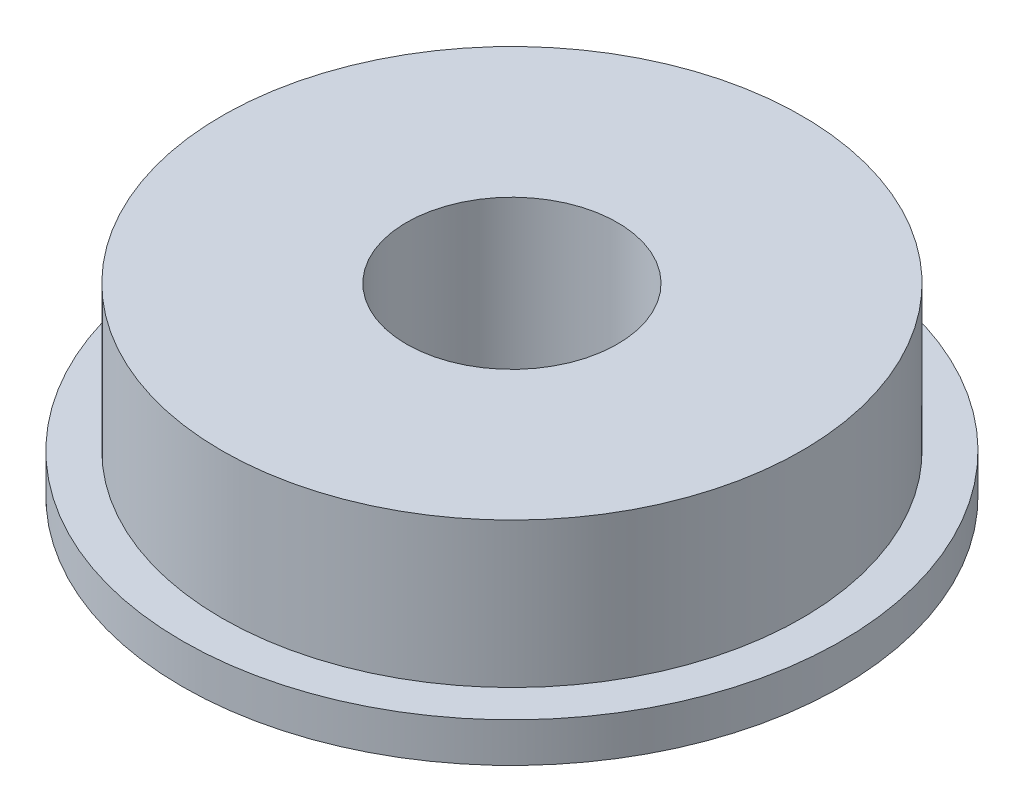
ISO-10303-21;
HEADER;
FILE_DESCRIPTION(('STEP AP214'),'2;1');
FILE_NAME('part.step','',(''),(''),'','','');
FILE_SCHEMA(('AUTOMOTIVE_DESIGN { 1 0 10303 214 1 1 1 1 }'));
ENDSEC;
DATA;
#1=APPLICATION_CONTEXT('core data for automotive mechanical design processes');
#2=APPLICATION_PROTOCOL_DEFINITION('international standard','automotive_design',2000,#1);
#3=PRODUCT_CONTEXT('',#1,'mechanical');
#4=PRODUCT('Part','Part','',(#3));
#5=PRODUCT_RELATED_PRODUCT_CATEGORY('part','',(#4));
#6=PRODUCT_DEFINITION_FORMATION('','',#4);
#7=PRODUCT_DEFINITION_CONTEXT('part definition',#1,'design');
#8=PRODUCT_DEFINITION('design','',#6,#7);
#9=PRODUCT_DEFINITION_SHAPE('','',#8);
#10=(LENGTH_UNIT() NAMED_UNIT(*) SI_UNIT(.MILLI.,.METRE.));
#11=(NAMED_UNIT(*) PLANE_ANGLE_UNIT() SI_UNIT($,.RADIAN.));
#12=(NAMED_UNIT(*) SI_UNIT($,.STERADIAN.) SOLID_ANGLE_UNIT());
#13=UNCERTAINTY_MEASURE_WITH_UNIT(LENGTH_MEASURE(1.E-05),#10,'distance_accuracy_value','');
#14=(GEOMETRIC_REPRESENTATION_CONTEXT(3) GLOBAL_UNCERTAINTY_ASSIGNED_CONTEXT((#13)) GLOBAL_UNIT_ASSIGNED_CONTEXT((#10,
#11,#12)) REPRESENTATION_CONTEXT('',''));
#15=CARTESIAN_POINT('',(0.,0.,0.));
#16=DIRECTION('',(0.,0.,1.));
#17=DIRECTION('',(1.,0.,0.));
#18=AXIS2_PLACEMENT_3D('',#15,#16,#17);
#19=CARTESIAN_POINT('',(0.,1.5,0.));
#20=DIRECTION('',(0.,-1.,0.));
#21=DIRECTION('',(0.,0.,-1.));
#22=AXIS2_PLACEMENT_3D('',#19,#20,#21);
#23=CYLINDRICAL_SURFACE('',#22,12.5);
#24=CARTESIAN_POINT('',(0.,1.5,0.));
#25=DIRECTION('',(0.,1.,0.));
#26=DIRECTION('',(0.,0.,1.));
#27=AXIS2_PLACEMENT_3D('',#24,#25,#26);
#28=CIRCLE('',#27,12.5);
#29=CARTESIAN_POINT('',(0.,1.5,12.5));
#30=VERTEX_POINT('',#29);
#31=EDGE_CURVE('E39',#30,#30,#28,.T.);
#32=ORIENTED_EDGE('',*,*,#31,.F.);
#33=EDGE_LOOP('',(#32));
#34=FACE_BOUND('',#33,.T.);
#35=CARTESIAN_POINT('',(0.,0.,0.));
#36=DIRECTION('',(0.,1.,0.));
#37=DIRECTION('',(0.,0.,1.));
#38=AXIS2_PLACEMENT_3D('',#35,#36,#37);
#39=CIRCLE('',#38,12.5);
#40=CARTESIAN_POINT('',(0.,0.,12.5));
#41=VERTEX_POINT('',#40);
#42=EDGE_CURVE('E35',#41,#41,#39,.T.);
#43=ORIENTED_EDGE('',*,*,#42,.T.);
#44=EDGE_LOOP('',(#43));
#45=FACE_BOUND('',#44,.T.);
#46=ADVANCED_FACE('F32',(#34,#45),#23,.T.);
#47=CARTESIAN_POINT('',(0.,1.5,0.));
#48=DIRECTION('',(0.,1.,0.));
#49=DIRECTION('',(0.,0.,1.));
#50=AXIS2_PLACEMENT_3D('',#47,#48,#49);
#51=PLANE('',#50);
#52=CARTESIAN_POINT('',(0.,1.5,0.));
#53=DIRECTION('',(0.,1.,0.));
#54=DIRECTION('',(0.,0.,1.));
#55=AXIS2_PLACEMENT_3D('',#52,#53,#54);
#56=CIRCLE('',#55,11.);
#57=CARTESIAN_POINT('',(0.,1.5,11.));
#58=VERTEX_POINT('',#57);
#59=EDGE_CURVE('E10',#58,#58,#56,.T.);
#60=ORIENTED_EDGE('',*,*,#59,.F.);
#61=EDGE_LOOP('',(#60));
#62=FACE_BOUND('',#61,.T.);
#63=ORIENTED_EDGE('',*,*,#31,.T.);
#64=EDGE_LOOP('',(#63));
#65=FACE_BOUND('',#64,.T.);
#66=ADVANCED_FACE('F70',(#62,#65),#51,.T.);
#67=CARTESIAN_POINT('',(0.,0.,0.));
#68=DIRECTION('',(0.,1.,0.));
#69=DIRECTION('',(0.,0.,1.));
#70=AXIS2_PLACEMENT_3D('',#67,#68,#69);
#71=PLANE('',#70);
#72=CARTESIAN_POINT('',(0.,0.,0.));
#73=DIRECTION('',(0.,1.,0.));
#74=DIRECTION('',(0.,0.,1.));
#75=AXIS2_PLACEMENT_3D('',#72,#73,#74);
#76=CIRCLE('',#75,4.);
#77=CARTESIAN_POINT('',(0.,0.,4.));
#78=VERTEX_POINT('',#77);
#79=EDGE_CURVE('E48',#78,#78,#76,.T.);
#80=ORIENTED_EDGE('',*,*,#79,.T.);
#81=EDGE_LOOP('',(#80));
#82=FACE_BOUND('',#81,.T.);
#83=ORIENTED_EDGE('',*,*,#42,.F.);
#84=EDGE_LOOP('',(#83));
#85=FACE_BOUND('',#84,.T.);
#86=ADVANCED_FACE('F65',(#82,#85),#71,.F.);
#87=CARTESIAN_POINT('',(0.,7.,0.));
#88=DIRECTION('',(0.,-1.,0.));
#89=DIRECTION('',(0.,0.,-1.));
#90=AXIS2_PLACEMENT_3D('',#87,#88,#89);
#91=CYLINDRICAL_SURFACE('',#90,11.);
#92=CARTESIAN_POINT('',(0.,7.,0.));
#93=DIRECTION('',(0.,1.,0.));
#94=DIRECTION('',(0.,0.,1.));
#95=AXIS2_PLACEMENT_3D('',#92,#93,#94);
#96=CIRCLE('',#95,11.);
#97=CARTESIAN_POINT('',(0.,7.,11.));
#98=VERTEX_POINT('',#97);
#99=EDGE_CURVE('E45',#98,#98,#96,.T.);
#100=ORIENTED_EDGE('',*,*,#99,.F.);
#101=EDGE_LOOP('',(#100));
#102=FACE_BOUND('',#101,.T.);
#103=ORIENTED_EDGE('',*,*,#59,.T.);
#104=EDGE_LOOP('',(#103));
#105=FACE_BOUND('',#104,.T.);
#106=ADVANCED_FACE('F60',(#102,#105),#91,.T.);
#107=CARTESIAN_POINT('',(0.,7.,0.));
#108=DIRECTION('',(0.,1.,0.));
#109=DIRECTION('',(0.,0.,1.));
#110=AXIS2_PLACEMENT_3D('',#107,#108,#109);
#111=PLANE('',#110);
#112=CARTESIAN_POINT('',(0.,7.,0.));
#113=DIRECTION('',(0.,1.,0.));
#114=DIRECTION('',(0.,0.,1.));
#115=AXIS2_PLACEMENT_3D('',#112,#113,#114);
#116=CIRCLE('',#115,4.);
#117=CARTESIAN_POINT('',(0.,7.,4.));
#118=VERTEX_POINT('',#117);
#119=EDGE_CURVE('E51',#118,#118,#116,.T.);
#120=ORIENTED_EDGE('',*,*,#119,.F.);
#121=EDGE_LOOP('',(#120));
#122=FACE_BOUND('',#121,.T.);
#123=ORIENTED_EDGE('',*,*,#99,.T.);
#124=EDGE_LOOP('',(#123));
#125=FACE_BOUND('',#124,.T.);
#126=ADVANCED_FACE('F57',(#122,#125),#111,.T.);
#127=CARTESIAN_POINT('',(0.,7.,0.));
#128=DIRECTION('',(0.,1.,0.));
#129=DIRECTION('',(0.,0.,1.));
#130=AXIS2_PLACEMENT_3D('',#127,#128,#129);
#131=CYLINDRICAL_SURFACE('',#130,4.);
#132=ORIENTED_EDGE('',*,*,#79,.F.);
#133=EDGE_LOOP('',(#132));
#134=FACE_BOUND('',#133,.T.);
#135=ORIENTED_EDGE('',*,*,#119,.T.);
#136=EDGE_LOOP('',(#135));
#137=FACE_BOUND('',#136,.T.);
#138=ADVANCED_FACE('F55',(#134,#137),#131,.F.);
#139=CLOSED_SHELL('',(#46,#66,#86,#106,#126,#138));
#140=MANIFOLD_SOLID_BREP('B2',#139);
#141=ADVANCED_BREP_SHAPE_REPRESENTATION('',(#18,#140),#14);
#142=SHAPE_DEFINITION_REPRESENTATION(#9,#141);
ENDSEC;
END-ISO-10303-21;
